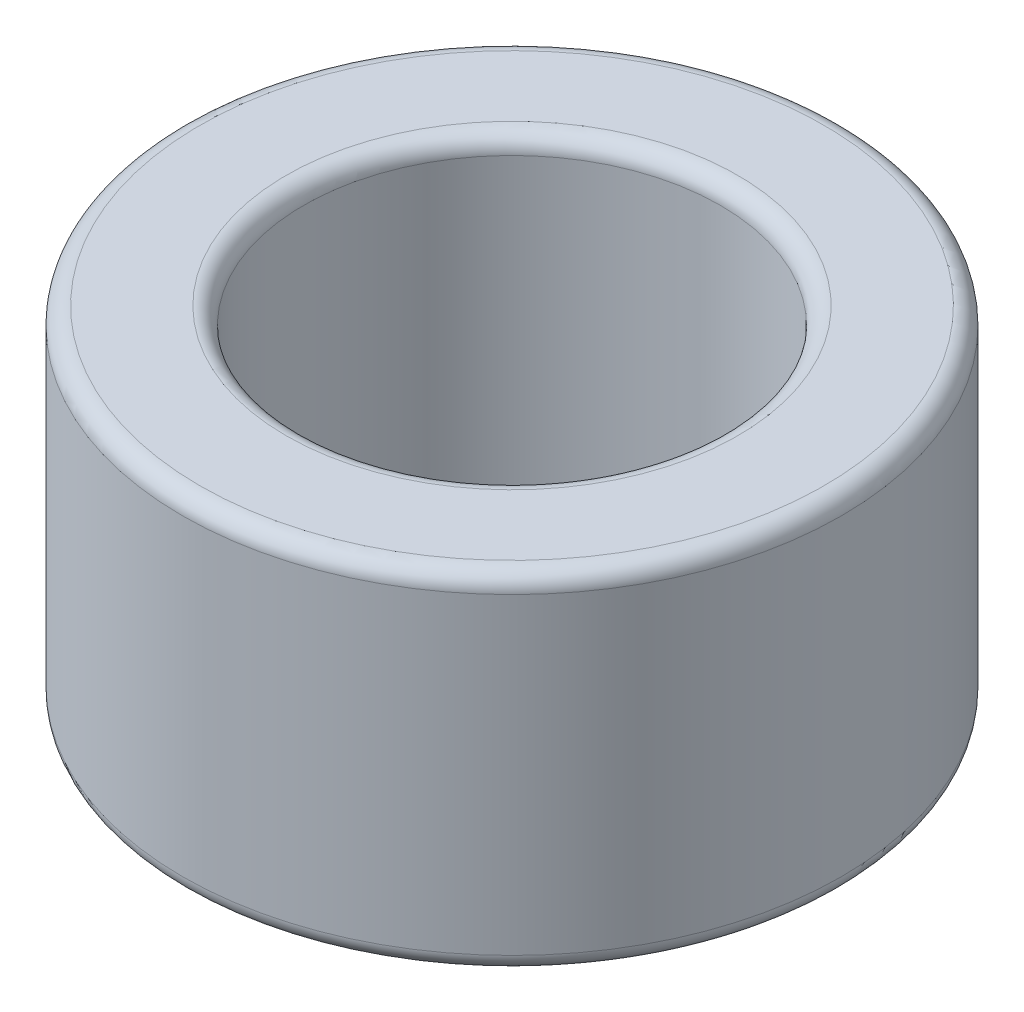
ISO-10303-21;
HEADER;
FILE_DESCRIPTION(('STEP AP214'),'2;1');
FILE_NAME('part.step','',(''),(''),'','','');
FILE_SCHEMA(('AUTOMOTIVE_DESIGN { 1 0 10303 214 1 1 1 1 }'));
ENDSEC;
DATA;
#1=APPLICATION_CONTEXT('core data for automotive mechanical design processes');
#2=APPLICATION_PROTOCOL_DEFINITION('international standard','automotive_design',2000,#1);
#3=PRODUCT_CONTEXT('',#1,'mechanical');
#4=PRODUCT('Part','Part','',(#3));
#5=PRODUCT_RELATED_PRODUCT_CATEGORY('part','',(#4));
#6=PRODUCT_DEFINITION_FORMATION('','',#4);
#7=PRODUCT_DEFINITION_CONTEXT('part definition',#1,'design');
#8=PRODUCT_DEFINITION('design','',#6,#7);
#9=PRODUCT_DEFINITION_SHAPE('','',#8);
#10=(LENGTH_UNIT() NAMED_UNIT(*) SI_UNIT(.MILLI.,.METRE.));
#11=(NAMED_UNIT(*) PLANE_ANGLE_UNIT() SI_UNIT($,.RADIAN.));
#12=(NAMED_UNIT(*) SI_UNIT($,.STERADIAN.) SOLID_ANGLE_UNIT());
#13=UNCERTAINTY_MEASURE_WITH_UNIT(LENGTH_MEASURE(1.E-05),#10,'distance_accuracy_value','');
#14=(GEOMETRIC_REPRESENTATION_CONTEXT(3) GLOBAL_UNCERTAINTY_ASSIGNED_CONTEXT((#13)) GLOBAL_UNIT_ASSIGNED_CONTEXT((#10,
#11,#12)) REPRESENTATION_CONTEXT('',''));
#15=CARTESIAN_POINT('',(0.,0.,0.));
#16=DIRECTION('',(0.,0.,1.));
#17=DIRECTION('',(1.,0.,0.));
#18=AXIS2_PLACEMENT_3D('',#15,#16,#17);
#19=CARTESIAN_POINT('',(0.,5.,0.));
#20=DIRECTION('',(0.,1.,0.));
#21=DIRECTION('',(0.,0.,1.));
#22=AXIS2_PLACEMENT_3D('',#19,#20,#21);
#23=PLANE('',#22);
#24=CARTESIAN_POINT('',(0.,5.,0.));
#25=DIRECTION('',(0.,1.,0.));
#26=DIRECTION('',(0.,0.,1.));
#27=AXIS2_PLACEMENT_3D('',#24,#25,#26);
#28=CIRCLE('',#27,3.25);
#29=CARTESIAN_POINT('',(0.,5.,3.25));
#30=VERTEX_POINT('',#29);
#31=EDGE_CURVE('E42',#30,#30,#28,.F.);
#32=ORIENTED_EDGE('',*,*,#31,.T.);
#33=EDGE_LOOP('',(#32));
#34=FACE_BOUND('',#33,.T.);
#35=CARTESIAN_POINT('',(0.,5.,0.));
#36=DIRECTION('',(0.,1.,0.));
#37=DIRECTION('',(0.,0.,1.));
#38=AXIS2_PLACEMENT_3D('',#35,#36,#37);
#39=CIRCLE('',#38,4.495);
#40=CARTESIAN_POINT('',(0.,5.,4.495));
#41=VERTEX_POINT('',#40);
#42=EDGE_CURVE('E46',#41,#41,#39,.T.);
#43=ORIENTED_EDGE('',*,*,#42,.T.);
#44=EDGE_LOOP('',(#43));
#45=FACE_BOUND('',#44,.T.);
#46=ADVANCED_FACE('F31',(#34,#45),#23,.T.);
#47=CARTESIAN_POINT('',(0.,0.,0.));
#48=DIRECTION('',(0.,1.,0.));
#49=DIRECTION('',(0.,0.,1.));
#50=AXIS2_PLACEMENT_3D('',#47,#48,#49);
#51=PLANE('',#50);
#52=CARTESIAN_POINT('',(0.,0.,0.));
#53=DIRECTION('',(0.,1.,0.));
#54=DIRECTION('',(0.,0.,1.));
#55=AXIS2_PLACEMENT_3D('',#52,#53,#54);
#56=CIRCLE('',#55,3.25);
#57=CARTESIAN_POINT('',(0.,0.,3.25));
#58=VERTEX_POINT('',#57);
#59=EDGE_CURVE('E57',#58,#58,#56,.T.);
#60=ORIENTED_EDGE('',*,*,#59,.T.);
#61=EDGE_LOOP('',(#60));
#62=FACE_BOUND('',#61,.T.);
#63=CARTESIAN_POINT('',(0.,0.,0.));
#64=DIRECTION('',(0.,1.,0.));
#65=DIRECTION('',(0.,0.,1.));
#66=AXIS2_PLACEMENT_3D('',#63,#64,#65);
#67=CIRCLE('',#66,4.495);
#68=CARTESIAN_POINT('',(0.,0.,4.495));
#69=VERTEX_POINT('',#68);
#70=EDGE_CURVE('E60',#69,#69,#67,.F.);
#71=ORIENTED_EDGE('',*,*,#70,.T.);
#72=EDGE_LOOP('',(#71));
#73=FACE_BOUND('',#72,.T.);
#74=ADVANCED_FACE('F64',(#62,#73),#51,.F.);
#75=CARTESIAN_POINT('',(0.,5.,0.));
#76=DIRECTION('',(0.,-1.,0.));
#77=DIRECTION('',(0.,0.,-1.));
#78=AXIS2_PLACEMENT_3D('',#75,#76,#77);
#79=CYLINDRICAL_SURFACE('',#78,4.745);
#80=CARTESIAN_POINT('',(0.,0.25,0.));
#81=DIRECTION('',(0.,1.,0.));
#82=DIRECTION('',(0.,0.,1.));
#83=AXIS2_PLACEMENT_3D('',#80,#81,#82);
#84=CIRCLE('',#83,4.745);
#85=CARTESIAN_POINT('',(0.,0.25,4.745));
#86=VERTEX_POINT('',#85);
#87=EDGE_CURVE('E10',#86,#86,#84,.T.);
#88=ORIENTED_EDGE('',*,*,#87,.T.);
#89=EDGE_LOOP('',(#88));
#90=FACE_BOUND('',#89,.T.);
#91=CARTESIAN_POINT('',(0.,4.75,0.));
#92=DIRECTION('',(0.,1.,0.));
#93=DIRECTION('',(0.,0.,1.));
#94=AXIS2_PLACEMENT_3D('',#91,#92,#93);
#95=CIRCLE('',#94,4.745);
#96=CARTESIAN_POINT('',(0.,4.75,4.745));
#97=VERTEX_POINT('',#96);
#98=EDGE_CURVE('E38',#97,#97,#95,.F.);
#99=ORIENTED_EDGE('',*,*,#98,.T.);
#100=EDGE_LOOP('',(#99));
#101=FACE_BOUND('',#100,.T.);
#102=ADVANCED_FACE('F84',(#90,#101),#79,.T.);
#103=CARTESIAN_POINT('',(0.,5.,0.));
#104=DIRECTION('',(0.,-1.,0.));
#105=DIRECTION('',(0.,0.,-1.));
#106=AXIS2_PLACEMENT_3D('',#103,#104,#105);
#107=CYLINDRICAL_SURFACE('',#106,3.);
#108=CARTESIAN_POINT('',(0.,0.25,0.));
#109=DIRECTION('',(0.,1.,0.));
#110=DIRECTION('',(0.,0.,1.));
#111=AXIS2_PLACEMENT_3D('',#108,#109,#110);
#112=CIRCLE('',#111,3.);
#113=CARTESIAN_POINT('',(0.,0.25,3.));
#114=VERTEX_POINT('',#113);
#115=EDGE_CURVE('E51',#114,#114,#112,.F.);
#116=ORIENTED_EDGE('',*,*,#115,.T.);
#117=EDGE_LOOP('',(#116));
#118=FACE_BOUND('',#117,.T.);
#119=CARTESIAN_POINT('',(0.,4.75,0.));
#120=DIRECTION('',(0.,1.,0.));
#121=DIRECTION('',(0.,0.,1.));
#122=AXIS2_PLACEMENT_3D('',#119,#120,#121);
#123=CIRCLE('',#122,3.);
#124=CARTESIAN_POINT('',(0.,4.75,3.));
#125=VERTEX_POINT('',#124);
#126=EDGE_CURVE('E54',#125,#125,#123,.T.);
#127=ORIENTED_EDGE('',*,*,#126,.T.);
#128=EDGE_LOOP('',(#127));
#129=FACE_BOUND('',#128,.T.);
#130=ADVANCED_FACE('F89',(#118,#129),#107,.F.);
#131=CARTESIAN_POINT('',(0.,0.25,0.));
#132=DIRECTION('',(0.,1.,0.));
#133=DIRECTION('',(0.,0.,1.));
#134=AXIS2_PLACEMENT_3D('',#131,#132,#133);
#135=TOROIDAL_SURFACE('',#134,3.25,0.25);
#136=ORIENTED_EDGE('',*,*,#115,.F.);
#137=EDGE_LOOP('',(#136));
#138=FACE_BOUND('',#137,.T.);
#139=ORIENTED_EDGE('',*,*,#59,.F.);
#140=EDGE_LOOP('',(#139));
#141=FACE_BOUND('',#140,.T.);
#142=ADVANCED_FACE('F75',(#138,#141),#135,.T.);
#143=CARTESIAN_POINT('',(0.,4.75,0.));
#144=DIRECTION('',(0.,1.,0.));
#145=DIRECTION('',(0.,0.,1.));
#146=AXIS2_PLACEMENT_3D('',#143,#144,#145);
#147=TOROIDAL_SURFACE('',#146,3.25,0.25);
#148=ORIENTED_EDGE('',*,*,#31,.F.);
#149=EDGE_LOOP('',(#148));
#150=FACE_BOUND('',#149,.T.);
#151=ORIENTED_EDGE('',*,*,#126,.F.);
#152=EDGE_LOOP('',(#151));
#153=FACE_BOUND('',#152,.T.);
#154=ADVANCED_FACE('F69',(#150,#153),#147,.T.);
#155=CARTESIAN_POINT('',(0.,0.25,0.));
#156=DIRECTION('',(0.,1.,0.));
#157=DIRECTION('',(0.,0.,1.));
#158=AXIS2_PLACEMENT_3D('',#155,#156,#157);
#159=TOROIDAL_SURFACE('',#158,4.495,0.25);
#160=ORIENTED_EDGE('',*,*,#70,.F.);
#161=EDGE_LOOP('',(#160));
#162=FACE_BOUND('',#161,.T.);
#163=ORIENTED_EDGE('',*,*,#87,.F.);
#164=EDGE_LOOP('',(#163));
#165=FACE_BOUND('',#164,.T.);
#166=ADVANCED_FACE('F66',(#162,#165),#159,.T.);
#167=CARTESIAN_POINT('',(0.,4.75,0.));
#168=DIRECTION('',(0.,1.,0.));
#169=DIRECTION('',(0.,0.,1.));
#170=AXIS2_PLACEMENT_3D('',#167,#168,#169);
#171=TOROIDAL_SURFACE('',#170,4.495,0.25);
#172=ORIENTED_EDGE('',*,*,#98,.F.);
#173=EDGE_LOOP('',(#172));
#174=FACE_BOUND('',#173,.T.);
#175=ORIENTED_EDGE('',*,*,#42,.F.);
#176=EDGE_LOOP('',(#175));
#177=FACE_BOUND('',#176,.T.);
#178=ADVANCED_FACE('F33',(#174,#177),#171,.T.);
#179=CLOSED_SHELL('',(#46,#74,#102,#130,#142,#154,#166,#178));
#180=MANIFOLD_SOLID_BREP('B2',#179);
#181=ADVANCED_BREP_SHAPE_REPRESENTATION('',(#18,#180),#14);
#182=SHAPE_DEFINITION_REPRESENTATION(#9,#181);
ENDSEC;
END-ISO-10303-21;
